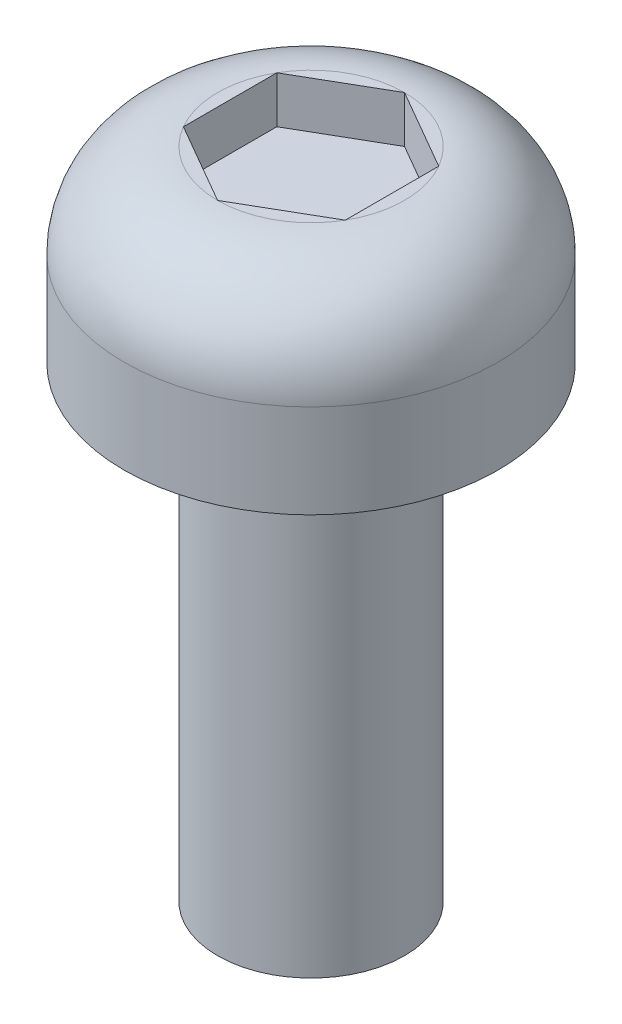
ISO-10303-21;
HEADER;
FILE_DESCRIPTION(('STEP AP214'),'2;1');
FILE_NAME('part.step','',(''),(''),'','','');
FILE_SCHEMA(('AUTOMOTIVE_DESIGN { 1 0 10303 214 1 1 1 1 }'));
ENDSEC;
DATA;
#1=APPLICATION_CONTEXT('core data for automotive mechanical design processes');
#2=APPLICATION_PROTOCOL_DEFINITION('international standard','automotive_design',2000,#1);
#3=PRODUCT_CONTEXT('',#1,'mechanical');
#4=PRODUCT('Part','Part','',(#3));
#5=PRODUCT_RELATED_PRODUCT_CATEGORY('part','',(#4));
#6=PRODUCT_DEFINITION_FORMATION('','',#4);
#7=PRODUCT_DEFINITION_CONTEXT('part definition',#1,'design');
#8=PRODUCT_DEFINITION('design','',#6,#7);
#9=PRODUCT_DEFINITION_SHAPE('','',#8);
#10=(LENGTH_UNIT() NAMED_UNIT(*) SI_UNIT(.MILLI.,.METRE.));
#11=(NAMED_UNIT(*) PLANE_ANGLE_UNIT() SI_UNIT($,.RADIAN.));
#12=(NAMED_UNIT(*) SI_UNIT($,.STERADIAN.) SOLID_ANGLE_UNIT());
#13=UNCERTAINTY_MEASURE_WITH_UNIT(LENGTH_MEASURE(1.E-05),#10,'distance_accuracy_value','');
#14=(GEOMETRIC_REPRESENTATION_CONTEXT(3) GLOBAL_UNCERTAINTY_ASSIGNED_CONTEXT((#13)) GLOBAL_UNIT_ASSIGNED_CONTEXT((#10,
#11,#12)) REPRESENTATION_CONTEXT('',''));
#15=CARTESIAN_POINT('',(0.,0.,0.));
#16=DIRECTION('',(0.,0.,1.));
#17=DIRECTION('',(1.,0.,0.));
#18=AXIS2_PLACEMENT_3D('',#15,#16,#17);
#19=CARTESIAN_POINT('',(0.,7.,0.));
#20=DIRECTION('',(0.,1.,0.));
#21=DIRECTION('',(0.,0.,1.));
#22=AXIS2_PLACEMENT_3D('',#19,#20,#21);
#23=PLANE('',#22);
#24=DIRECTION('',(0.,0.,1.));
#25=VECTOR('',#24,1.);
#26=CARTESIAN_POINT('',(-0.86602540378444,7.,0.));
#27=LINE('',#26,#25);
#28=CARTESIAN_POINT('',(-0.86602540378444,7.,-0.499999999999998));
#29=VERTEX_POINT('',#28);
#30=CARTESIAN_POINT('',(-0.86602540378444,7.,0.499999999999999));
#31=VERTEX_POINT('',#30);
#32=EDGE_CURVE('E137',#29,#31,#27,.T.);
#33=ORIENTED_EDGE('',*,*,#32,.F.);
#34=CARTESIAN_POINT('',(0.,7.,0.));
#35=DIRECTION('',(0.,1.,0.));
#36=DIRECTION('',(0.,0.,1.));
#37=AXIS2_PLACEMENT_3D('',#34,#35,#36);
#38=CIRCLE('',#37,1.);
#39=EDGE_CURVE('E191',#29,#31,#38,.T.);
#40=ORIENTED_EDGE('',*,*,#39,.T.);
#41=EDGE_LOOP('',(#33,#40));
#42=FACE_BOUND('',#41,.T.);
#43=ADVANCED_FACE('F44',(#42),#23,.T.);
#44=DIRECTION('',(0.866025403784438,0.,0.500000000000001));
#45=VECTOR('',#44,1.);
#46=CARTESIAN_POINT('',(-0.43301270189222,7.,0.749999999999999));
#47=LINE('',#46,#45);
#48=CARTESIAN_POINT('',(0.,7.,1.));
#49=VERTEX_POINT('',#48);
#50=EDGE_CURVE('E143',#31,#49,#47,.T.);
#51=ORIENTED_EDGE('',*,*,#50,.F.);
#52=EDGE_CURVE('E180',#31,#49,#38,.T.);
#53=ORIENTED_EDGE('',*,*,#52,.T.);
#54=EDGE_LOOP('',(#51,#53));
#55=FACE_BOUND('',#54,.T.);
#56=ADVANCED_FACE('F221',(#55),#23,.T.);
#57=DIRECTION('',(0.866025403784438,0.,-0.500000000000001));
#58=VECTOR('',#57,1.);
#59=CARTESIAN_POINT('',(0.43301270189222,7.,0.749999999999999));
#60=LINE('',#59,#58);
#61=CARTESIAN_POINT('',(0.86602540378444,7.,0.499999999999998));
#62=VERTEX_POINT('',#61);
#63=EDGE_CURVE('E144',#49,#62,#60,.T.);
#64=ORIENTED_EDGE('',*,*,#63,.F.);
#65=EDGE_CURVE('E53',#49,#62,#38,.T.);
#66=ORIENTED_EDGE('',*,*,#65,.T.);
#67=EDGE_LOOP('',(#64,#66));
#68=FACE_BOUND('',#67,.T.);
#69=ADVANCED_FACE('F216',(#68),#23,.T.);
#70=DIRECTION('',(0.,0.,-1.));
#71=VECTOR('',#70,1.);
#72=CARTESIAN_POINT('',(0.86602540378444,7.,0.));
#73=LINE('',#72,#71);
#74=CARTESIAN_POINT('',(0.86602540378444,7.,-0.499999999999998));
#75=VERTEX_POINT('',#74);
#76=EDGE_CURVE('E112',#62,#75,#73,.T.);
#77=ORIENTED_EDGE('',*,*,#76,.F.);
#78=EDGE_CURVE('E185',#62,#75,#38,.T.);
#79=ORIENTED_EDGE('',*,*,#78,.T.);
#80=EDGE_LOOP('',(#77,#79));
#81=FACE_BOUND('',#80,.T.);
#82=ADVANCED_FACE('F212',(#81),#23,.T.);
#83=DIRECTION('',(-0.866025403784438,0.,-0.500000000000001));
#84=VECTOR('',#83,1.);
#85=CARTESIAN_POINT('',(0.43301270189222,7.,-0.749999999999999));
#86=LINE('',#85,#84);
#87=CARTESIAN_POINT('',(0.,7.,-1.));
#88=VERTEX_POINT('',#87);
#89=EDGE_CURVE('E61',#75,#88,#86,.T.);
#90=ORIENTED_EDGE('',*,*,#89,.F.);
#91=EDGE_CURVE('E187',#75,#88,#38,.T.);
#92=ORIENTED_EDGE('',*,*,#91,.T.);
#93=EDGE_LOOP('',(#90,#92));
#94=FACE_BOUND('',#93,.T.);
#95=ADVANCED_FACE('F209',(#94),#23,.T.);
#96=CARTESIAN_POINT('',(0.,5.,0.));
#97=DIRECTION('',(0.,-1.,0.));
#98=DIRECTION('',(0.,0.,-1.));
#99=AXIS2_PLACEMENT_3D('',#96,#97,#98);
#100=CYLINDRICAL_SURFACE('',#99,1.);
#101=CARTESIAN_POINT('',(0.,5.,0.));
#102=DIRECTION('',(0.,1.,0.));
#103=DIRECTION('',(0.,0.,1.));
#104=AXIS2_PLACEMENT_3D('',#101,#102,#103);
#105=CIRCLE('',#104,1.);
#106=CARTESIAN_POINT('',(0.,5.,1.));
#107=VERTEX_POINT('',#106);
#108=EDGE_CURVE('E172',#107,#107,#105,.T.);
#109=ORIENTED_EDGE('',*,*,#108,.F.);
#110=EDGE_LOOP('',(#109));
#111=FACE_BOUND('',#110,.T.);
#112=CARTESIAN_POINT('',(0.,0.,0.));
#113=DIRECTION('',(0.,1.,0.));
#114=DIRECTION('',(0.,0.,1.));
#115=AXIS2_PLACEMENT_3D('',#112,#113,#114);
#116=CIRCLE('',#115,1.);
#117=CARTESIAN_POINT('',(0.,0.,1.));
#118=VERTEX_POINT('',#117);
#119=EDGE_CURVE('E175',#118,#118,#116,.T.);
#120=ORIENTED_EDGE('',*,*,#119,.T.);
#121=EDGE_LOOP('',(#120));
#122=FACE_BOUND('',#121,.T.);
#123=ADVANCED_FACE('F225',(#111,#122),#100,.T.);
#124=CARTESIAN_POINT('',(0.,0.,0.));
#125=DIRECTION('',(0.,1.,0.));
#126=DIRECTION('',(0.,0.,1.));
#127=AXIS2_PLACEMENT_3D('',#124,#125,#126);
#128=PLANE('',#127);
#129=ORIENTED_EDGE('',*,*,#119,.F.);
#130=EDGE_LOOP('',(#129));
#131=FACE_BOUND('',#130,.T.);
#132=ADVANCED_FACE('F238',(#131),#128,.F.);
#133=CARTESIAN_POINT('',(0.,7.,0.));
#134=DIRECTION('',(0.,-1.,0.));
#135=DIRECTION('',(0.,0.,-1.));
#136=AXIS2_PLACEMENT_3D('',#133,#134,#135);
#137=CYLINDRICAL_SURFACE('',#136,2.);
#138=CARTESIAN_POINT('',(0.,6.,0.));
#139=DIRECTION('',(0.,1.,0.));
#140=DIRECTION('',(0.,0.,1.));
#141=AXIS2_PLACEMENT_3D('',#138,#139,#140);
#142=CIRCLE('',#141,2.);
#143=CARTESIAN_POINT('',(0.,6.,2.));
#144=VERTEX_POINT('',#143);
#145=EDGE_CURVE('E11',#144,#144,#142,.F.);
#146=ORIENTED_EDGE('',*,*,#145,.T.);
#147=EDGE_LOOP('',(#146));
#148=FACE_BOUND('',#147,.T.);
#149=CARTESIAN_POINT('',(0.,5.,0.));
#150=DIRECTION('',(0.,1.,0.));
#151=DIRECTION('',(0.,0.,1.));
#152=AXIS2_PLACEMENT_3D('',#149,#150,#151);
#153=CIRCLE('',#152,2.);
#154=CARTESIAN_POINT('',(0.,5.,2.));
#155=VERTEX_POINT('',#154);
#156=EDGE_CURVE('E157',#155,#155,#153,.T.);
#157=ORIENTED_EDGE('',*,*,#156,.T.);
#158=EDGE_LOOP('',(#157));
#159=FACE_BOUND('',#158,.T.);
#160=ADVANCED_FACE('F233',(#148,#159),#137,.T.);
#161=DIRECTION('',(-0.866025403784438,0.,0.500000000000001));
#162=VECTOR('',#161,1.);
#163=CARTESIAN_POINT('',(-0.43301270189222,7.,-0.749999999999999));
#164=LINE('',#163,#162);
#165=EDGE_CURVE('E153',#88,#29,#164,.T.);
#166=ORIENTED_EDGE('',*,*,#165,.F.);
#167=EDGE_CURVE('E197',#88,#29,#38,.T.);
#168=ORIENTED_EDGE('',*,*,#167,.T.);
#169=EDGE_LOOP('',(#166,#168));
#170=FACE_BOUND('',#169,.T.);
#171=ADVANCED_FACE('F224',(#170),#23,.T.);
#172=CARTESIAN_POINT('',(0.,5.,0.));
#173=DIRECTION('',(0.,1.,0.));
#174=DIRECTION('',(0.,0.,1.));
#175=AXIS2_PLACEMENT_3D('',#172,#173,#174);
#176=PLANE('',#175);
#177=ORIENTED_EDGE('',*,*,#108,.T.);
#178=EDGE_LOOP('',(#177));
#179=FACE_BOUND('',#178,.T.);
#180=ORIENTED_EDGE('',*,*,#156,.F.);
#181=EDGE_LOOP('',(#180));
#182=FACE_BOUND('',#181,.T.);
#183=ADVANCED_FACE('F232',(#179,#182),#176,.F.);
#184=CARTESIAN_POINT('',(0.,6.,0.));
#185=DIRECTION('',(0.,1.,0.));
#186=DIRECTION('',(0.,0.,1.));
#187=AXIS2_PLACEMENT_3D('',#184,#185,#186);
#188=DEGENERATE_TOROIDAL_SURFACE('',#187,1.,1.,.T.);
#189=ORIENTED_EDGE('',*,*,#145,.F.);
#190=EDGE_LOOP('',(#189));
#191=FACE_BOUND('',#190,.T.);
#192=ORIENTED_EDGE('',*,*,#65,.F.);
#193=ORIENTED_EDGE('',*,*,#52,.F.);
#194=ORIENTED_EDGE('',*,*,#39,.F.);
#195=ORIENTED_EDGE('',*,*,#167,.F.);
#196=ORIENTED_EDGE('',*,*,#91,.F.);
#197=ORIENTED_EDGE('',*,*,#78,.F.);
#198=EDGE_LOOP('',(#192,#193,#194,#195,#196,#197));
#199=FACE_BOUND('',#198,.T.);
#200=ADVANCED_FACE('F50',(#191,#199),#188,.T.);
#201=CARTESIAN_POINT('',(-0.86602540378444,6.5,0.));
#202=DIRECTION('',(-1.,0.,0.));
#203=DIRECTION('',(0.,0.,1.));
#204=AXIS2_PLACEMENT_3D('',#201,#202,#203);
#205=PLANE('',#204);
#206=ORIENTED_EDGE('',*,*,#32,.T.);
#207=DIRECTION('',(0.,1.,0.));
#208=VECTOR('',#207,1.);
#209=CARTESIAN_POINT('',(-0.86602540378444,6.5,0.499999999999999));
#210=LINE('',#209,#208);
#211=CARTESIAN_POINT('',(-0.86602540378444,6.5,0.499999999999999));
#212=VERTEX_POINT('',#211);
#213=EDGE_CURVE('E91',#212,#31,#210,.T.);
#214=ORIENTED_EDGE('',*,*,#213,.F.);
#215=DIRECTION('',(0.,0.,1.));
#216=VECTOR('',#215,1.);
#217=CARTESIAN_POINT('',(-0.86602540378444,6.5,0.));
#218=LINE('',#217,#216);
#219=CARTESIAN_POINT('',(-0.86602540378444,6.5,-0.499999999999998));
#220=VERTEX_POINT('',#219);
#221=EDGE_CURVE('E156',#220,#212,#218,.T.);
#222=ORIENTED_EDGE('',*,*,#221,.F.);
#223=DIRECTION('',(0.,1.,0.));
#224=VECTOR('',#223,1.);
#225=CARTESIAN_POINT('',(-0.86602540378444,6.5,-0.499999999999998));
#226=LINE('',#225,#224);
#227=EDGE_CURVE('E69',#220,#29,#226,.T.);
#228=ORIENTED_EDGE('',*,*,#227,.T.);
#229=EDGE_LOOP('',(#206,#214,#222,#228));
#230=FACE_BOUND('',#229,.T.);
#231=ADVANCED_FACE('F243',(#230),#205,.F.);
#232=CARTESIAN_POINT('',(-0.43301270189222,6.5,-0.749999999999999));
#233=DIRECTION('',(-0.500000000000001,0.,-0.866025403784438));
#234=DIRECTION('',(-0.866025403784438,0.,0.500000000000001));
#235=AXIS2_PLACEMENT_3D('',#232,#233,#234);
#236=PLANE('',#235);
#237=ORIENTED_EDGE('',*,*,#165,.T.);
#238=ORIENTED_EDGE('',*,*,#227,.F.);
#239=DIRECTION('',(-0.866025403784438,0.,0.500000000000001));
#240=VECTOR('',#239,1.);
#241=CARTESIAN_POINT('',(-0.43301270189222,6.5,-0.749999999999999));
#242=LINE('',#241,#240);
#243=CARTESIAN_POINT('',(0.,6.5,-1.));
#244=VERTEX_POINT('',#243);
#245=EDGE_CURVE('E125',#244,#220,#242,.T.);
#246=ORIENTED_EDGE('',*,*,#245,.F.);
#247=DIRECTION('',(0.,1.,0.));
#248=VECTOR('',#247,1.);
#249=CARTESIAN_POINT('',(0.,6.5,-1.));
#250=LINE('',#249,#248);
#251=EDGE_CURVE('E114',#244,#88,#250,.T.);
#252=ORIENTED_EDGE('',*,*,#251,.T.);
#253=EDGE_LOOP('',(#237,#238,#246,#252));
#254=FACE_BOUND('',#253,.T.);
#255=ADVANCED_FACE('F242',(#254),#236,.F.);
#256=CARTESIAN_POINT('',(0.43301270189222,6.5,-0.749999999999999));
#257=DIRECTION('',(0.500000000000001,0.,-0.866025403784438));
#258=DIRECTION('',(-0.866025403784438,0.,-0.500000000000001));
#259=AXIS2_PLACEMENT_3D('',#256,#257,#258);
#260=PLANE('',#259);
#261=ORIENTED_EDGE('',*,*,#89,.T.);
#262=ORIENTED_EDGE('',*,*,#251,.F.);
#263=DIRECTION('',(-0.866025403784438,0.,-0.500000000000001));
#264=VECTOR('',#263,1.);
#265=CARTESIAN_POINT('',(0.43301270189222,6.5,-0.749999999999999));
#266=LINE('',#265,#264);
#267=CARTESIAN_POINT('',(0.86602540378444,6.5,-0.499999999999998));
#268=VERTEX_POINT('',#267);
#269=EDGE_CURVE('E120',#268,#244,#266,.T.);
#270=ORIENTED_EDGE('',*,*,#269,.F.);
#271=DIRECTION('',(0.,1.,0.));
#272=VECTOR('',#271,1.);
#273=CARTESIAN_POINT('',(0.86602540378444,6.5,-0.499999999999998));
#274=LINE('',#273,#272);
#275=EDGE_CURVE('E102',#268,#75,#274,.T.);
#276=ORIENTED_EDGE('',*,*,#275,.T.);
#277=EDGE_LOOP('',(#261,#262,#270,#276));
#278=FACE_BOUND('',#277,.T.);
#279=ADVANCED_FACE('F117',(#278),#260,.F.);
#280=CARTESIAN_POINT('',(0.86602540378444,6.5,0.));
#281=DIRECTION('',(1.,0.,0.));
#282=DIRECTION('',(0.,0.,-1.));
#283=AXIS2_PLACEMENT_3D('',#280,#281,#282);
#284=PLANE('',#283);
#285=ORIENTED_EDGE('',*,*,#76,.T.);
#286=ORIENTED_EDGE('',*,*,#275,.F.);
#287=DIRECTION('',(0.,0.,-1.));
#288=VECTOR('',#287,1.);
#289=CARTESIAN_POINT('',(0.86602540378444,6.5,0.));
#290=LINE('',#289,#288);
#291=CARTESIAN_POINT('',(0.86602540378444,6.5,0.499999999999998));
#292=VERTEX_POINT('',#291);
#293=EDGE_CURVE('E107',#292,#268,#290,.T.);
#294=ORIENTED_EDGE('',*,*,#293,.F.);
#295=DIRECTION('',(0.,1.,0.));
#296=VECTOR('',#295,1.);
#297=CARTESIAN_POINT('',(0.86602540378444,6.5,0.499999999999998));
#298=LINE('',#297,#296);
#299=EDGE_CURVE('E111',#292,#62,#298,.T.);
#300=ORIENTED_EDGE('',*,*,#299,.T.);
#301=EDGE_LOOP('',(#285,#286,#294,#300));
#302=FACE_BOUND('',#301,.T.);
#303=ADVANCED_FACE('F106',(#302),#284,.F.);
#304=CARTESIAN_POINT('',(0.43301270189222,6.5,0.749999999999999));
#305=DIRECTION('',(0.500000000000001,0.,0.866025403784438));
#306=DIRECTION('',(0.866025403784438,0.,-0.500000000000001));
#307=AXIS2_PLACEMENT_3D('',#304,#305,#306);
#308=PLANE('',#307);
#309=ORIENTED_EDGE('',*,*,#63,.T.);
#310=ORIENTED_EDGE('',*,*,#299,.F.);
#311=DIRECTION('',(0.866025403784438,0.,-0.500000000000001));
#312=VECTOR('',#311,1.);
#313=CARTESIAN_POINT('',(0.43301270189222,6.5,0.749999999999999));
#314=LINE('',#313,#312);
#315=CARTESIAN_POINT('',(0.,6.5,1.));
#316=VERTEX_POINT('',#315);
#317=EDGE_CURVE('E126',#316,#292,#314,.T.);
#318=ORIENTED_EDGE('',*,*,#317,.F.);
#319=DIRECTION('',(0.,1.,0.));
#320=VECTOR('',#319,1.);
#321=CARTESIAN_POINT('',(0.,6.5,1.));
#322=LINE('',#321,#320);
#323=EDGE_CURVE('E163',#316,#49,#322,.T.);
#324=ORIENTED_EDGE('',*,*,#323,.T.);
#325=EDGE_LOOP('',(#309,#310,#318,#324));
#326=FACE_BOUND('',#325,.T.);
#327=ADVANCED_FACE('F247',(#326),#308,.F.);
#328=CARTESIAN_POINT('',(-0.43301270189222,6.5,0.749999999999999));
#329=DIRECTION('',(-0.500000000000001,0.,0.866025403784438));
#330=DIRECTION('',(0.866025403784438,0.,0.500000000000001));
#331=AXIS2_PLACEMENT_3D('',#328,#329,#330);
#332=PLANE('',#331);
#333=ORIENTED_EDGE('',*,*,#50,.T.);
#334=ORIENTED_EDGE('',*,*,#323,.F.);
#335=DIRECTION('',(0.866025403784438,0.,0.500000000000001));
#336=VECTOR('',#335,1.);
#337=CARTESIAN_POINT('',(-0.43301270189222,6.5,0.749999999999999));
#338=LINE('',#337,#336);
#339=EDGE_CURVE('E135',#212,#316,#338,.T.);
#340=ORIENTED_EDGE('',*,*,#339,.F.);
#341=ORIENTED_EDGE('',*,*,#213,.T.);
#342=EDGE_LOOP('',(#333,#334,#340,#341));
#343=FACE_BOUND('',#342,.T.);
#344=ADVANCED_FACE('F246',(#343),#332,.F.);
#345=CARTESIAN_POINT('',(0.,6.5,0.));
#346=DIRECTION('',(0.,1.,0.));
#347=DIRECTION('',(0.,0.,1.));
#348=AXIS2_PLACEMENT_3D('',#345,#346,#347);
#349=PLANE('',#348);
#350=ORIENTED_EDGE('',*,*,#221,.T.);
#351=ORIENTED_EDGE('',*,*,#339,.T.);
#352=ORIENTED_EDGE('',*,*,#317,.T.);
#353=ORIENTED_EDGE('',*,*,#293,.T.);
#354=ORIENTED_EDGE('',*,*,#269,.T.);
#355=ORIENTED_EDGE('',*,*,#245,.T.);
#356=EDGE_LOOP('',(#350,#351,#352,#353,#354,#355));
#357=FACE_BOUND('',#356,.T.);
#358=ADVANCED_FACE('F124',(#357),#349,.T.);
#359=CLOSED_SHELL('',(#43,#56,#69,#82,#95,#123,#132,#160,#171,#183,#200,#231,#255,#279,#303,
#327,#344,#358));
#360=MANIFOLD_SOLID_BREP('B2',#359);
#361=ADVANCED_BREP_SHAPE_REPRESENTATION('',(#18,#360),#14);
#362=SHAPE_DEFINITION_REPRESENTATION(#9,#361);
ENDSEC;
END-ISO-10303-21;
